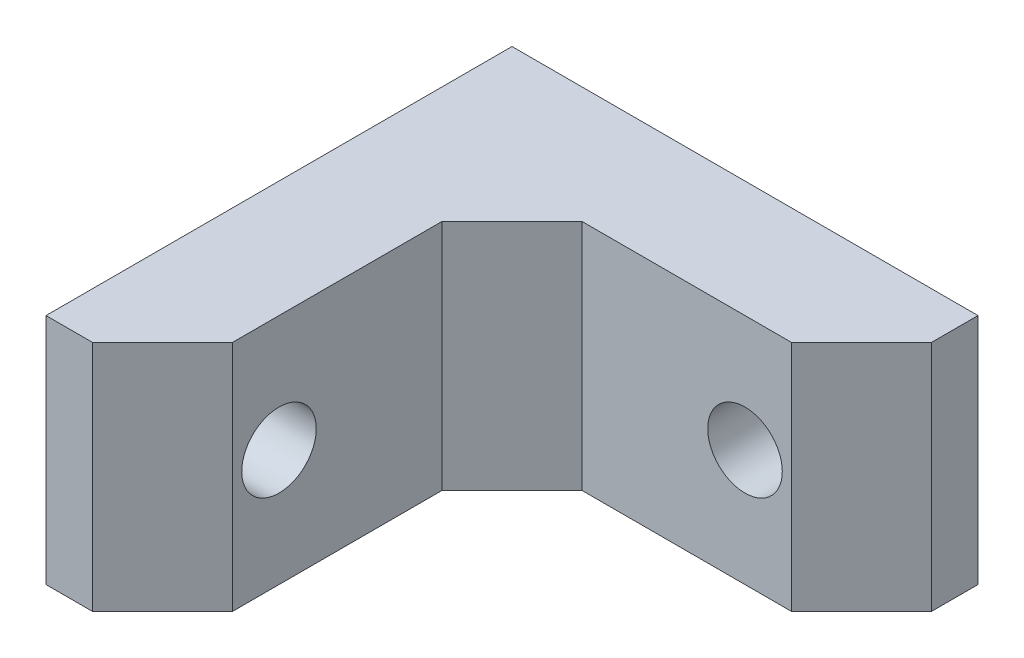
ISO-10303-21;
HEADER;
FILE_DESCRIPTION(('STEP AP214'),'2;1');
FILE_NAME('part.step','',(''),(''),'','','');
FILE_SCHEMA(('AUTOMOTIVE_DESIGN { 1 0 10303 214 1 1 1 1 }'));
ENDSEC;
DATA;
#1=APPLICATION_CONTEXT('core data for automotive mechanical design processes');
#2=APPLICATION_PROTOCOL_DEFINITION('international standard','automotive_design',2000,#1);
#3=PRODUCT_CONTEXT('',#1,'mechanical');
#4=PRODUCT('Part','Part','',(#3));
#5=PRODUCT_RELATED_PRODUCT_CATEGORY('part','',(#4));
#6=PRODUCT_DEFINITION_FORMATION('','',#4);
#7=PRODUCT_DEFINITION_CONTEXT('part definition',#1,'design');
#8=PRODUCT_DEFINITION('design','',#6,#7);
#9=PRODUCT_DEFINITION_SHAPE('','',#8);
#10=(LENGTH_UNIT() NAMED_UNIT(*) SI_UNIT(.MILLI.,.METRE.));
#11=(NAMED_UNIT(*) PLANE_ANGLE_UNIT() SI_UNIT($,.RADIAN.));
#12=(NAMED_UNIT(*) SI_UNIT($,.STERADIAN.) SOLID_ANGLE_UNIT());
#13=UNCERTAINTY_MEASURE_WITH_UNIT(LENGTH_MEASURE(1.E-05),#10,'distance_accuracy_value','');
#14=(GEOMETRIC_REPRESENTATION_CONTEXT(3) GLOBAL_UNCERTAINTY_ASSIGNED_CONTEXT((#13)) GLOBAL_UNIT_ASSIGNED_CONTEXT((#10,
#11,#12)) REPRESENTATION_CONTEXT('',''));
#15=CARTESIAN_POINT('',(0.,0.,0.));
#16=DIRECTION('',(0.,0.,1.));
#17=DIRECTION('',(1.,0.,0.));
#18=AXIS2_PLACEMENT_3D('',#15,#16,#17);
#19=CARTESIAN_POINT('',(0.,0.,5.));
#20=DIRECTION('',(0.,1.,0.));
#21=DIRECTION('',(0.,0.,1.));
#22=AXIS2_PLACEMENT_3D('',#19,#20,#21);
#23=PLANE('',#22);
#24=DIRECTION('',(0.,0.,-1.));
#25=VECTOR('',#24,1.);
#26=CARTESIAN_POINT('',(5.,0.,20.));
#27=LINE('',#26,#25);
#28=CARTESIAN_POINT('',(5.,0.,17.));
#29=VERTEX_POINT('',#28);
#30=CARTESIAN_POINT('',(5.,0.,7.99999999999998));
#31=VERTEX_POINT('',#30);
#32=EDGE_CURVE('E146',#29,#31,#27,.T.);
#33=ORIENTED_EDGE('',*,*,#32,.F.);
#34=DIRECTION('',(0.707106781186549,0.,-0.707106781186546));
#35=VECTOR('',#34,1.);
#36=CARTESIAN_POINT('',(5.,0.,17.));
#37=LINE('',#36,#35);
#38=CARTESIAN_POINT('',(1.99999999999999,0.,20.));
#39=VERTEX_POINT('',#38);
#40=EDGE_CURVE('E198',#29,#39,#37,.F.);
#41=ORIENTED_EDGE('',*,*,#40,.T.);
#42=DIRECTION('',(1.,0.,0.));
#43=VECTOR('',#42,1.);
#44=CARTESIAN_POINT('',(0.,0.,20.));
#45=LINE('',#44,#43);
#46=CARTESIAN_POINT('',(0.,0.,20.));
#47=VERTEX_POINT('',#46);
#48=EDGE_CURVE('E130',#47,#39,#45,.T.);
#49=ORIENTED_EDGE('',*,*,#48,.F.);
#50=DIRECTION('',(0.,0.,-1.));
#51=VECTOR('',#50,1.);
#52=CARTESIAN_POINT('',(0.,0.,20.));
#53=LINE('',#52,#51);
#54=CARTESIAN_POINT('',(0.,0.,0.));
#55=VERTEX_POINT('',#54);
#56=EDGE_CURVE('E116',#47,#55,#53,.T.);
#57=ORIENTED_EDGE('',*,*,#56,.T.);
#58=DIRECTION('',(1.,0.,0.));
#59=VECTOR('',#58,1.);
#60=CARTESIAN_POINT('',(0.,0.,0.));
#61=LINE('',#60,#59);
#62=CARTESIAN_POINT('',(20.,0.,0.));
#63=VERTEX_POINT('',#62);
#64=EDGE_CURVE('E236',#55,#63,#61,.T.);
#65=ORIENTED_EDGE('',*,*,#64,.T.);
#66=DIRECTION('',(0.,0.,-1.));
#67=VECTOR('',#66,1.);
#68=CARTESIAN_POINT('',(20.,0.,5.));
#69=LINE('',#68,#67);
#70=CARTESIAN_POINT('',(20.,0.,1.99999999999999));
#71=VERTEX_POINT('',#70);
#72=EDGE_CURVE('E153',#71,#63,#69,.T.);
#73=ORIENTED_EDGE('',*,*,#72,.F.);
#74=DIRECTION('',(-0.707106781186546,0.,0.707106781186549));
#75=VECTOR('',#74,1.);
#76=CARTESIAN_POINT('',(17.,0.,5.));
#77=LINE('',#76,#75);
#78=CARTESIAN_POINT('',(17.,0.,5.));
#79=VERTEX_POINT('',#78);
#80=EDGE_CURVE('E156',#71,#79,#77,.T.);
#81=ORIENTED_EDGE('',*,*,#80,.T.);
#82=DIRECTION('',(1.,0.,0.));
#83=VECTOR('',#82,1.);
#84=CARTESIAN_POINT('',(0.,0.,5.));
#85=LINE('',#84,#83);
#86=CARTESIAN_POINT('',(8.00000000000002,0.,5.));
#87=VERTEX_POINT('',#86);
#88=EDGE_CURVE('E157',#87,#79,#85,.T.);
#89=ORIENTED_EDGE('',*,*,#88,.F.);
#90=DIRECTION('',(0.707106781186552,0.,-0.707106781186543));
#91=VECTOR('',#90,1.);
#92=CARTESIAN_POINT('',(3.99999999999996,0.,9.00000000000001));
#93=LINE('',#92,#91);
#94=EDGE_CURVE('E43',#87,#31,#93,.F.);
#95=ORIENTED_EDGE('',*,*,#94,.T.);
#96=EDGE_LOOP('',(#33,#41,#49,#57,#65,#73,#81,#89,#95));
#97=FACE_BOUND('',#96,.T.);
#98=ADVANCED_FACE('F35',(#97),#23,.F.);
#99=CARTESIAN_POINT('',(20.,0.,5.));
#100=DIRECTION('',(-1.,0.,0.));
#101=DIRECTION('',(0.,0.,1.));
#102=AXIS2_PLACEMENT_3D('',#99,#100,#101);
#103=PLANE('',#102);
#104=DIRECTION('',(0.,0.,-1.));
#105=VECTOR('',#104,1.);
#106=CARTESIAN_POINT('',(20.,10.,5.));
#107=LINE('',#106,#105);
#108=CARTESIAN_POINT('',(20.,10.,1.99999999999999));
#109=VERTEX_POINT('',#108);
#110=CARTESIAN_POINT('',(20.,10.,0.));
#111=VERTEX_POINT('',#110);
#112=EDGE_CURVE('E171',#109,#111,#107,.T.);
#113=ORIENTED_EDGE('',*,*,#112,.F.);
#114=DIRECTION('',(0.,-1.,0.));
#115=VECTOR('',#114,1.);
#116=CARTESIAN_POINT('',(20.,0.,1.99999999999999));
#117=LINE('',#116,#115);
#118=EDGE_CURVE('E180',#109,#71,#117,.T.);
#119=ORIENTED_EDGE('',*,*,#118,.T.);
#120=ORIENTED_EDGE('',*,*,#72,.T.);
#121=DIRECTION('',(0.,1.,0.));
#122=VECTOR('',#121,1.);
#123=CARTESIAN_POINT('',(20.,0.,0.));
#124=LINE('',#123,#122);
#125=EDGE_CURVE('E239',#63,#111,#124,.T.);
#126=ORIENTED_EDGE('',*,*,#125,.T.);
#127=EDGE_LOOP('',(#113,#119,#120,#126));
#128=FACE_BOUND('',#127,.T.);
#129=ADVANCED_FACE('F212',(#128),#103,.F.);
#130=CARTESIAN_POINT('',(0.,10.,5.));
#131=DIRECTION('',(0.,1.,0.));
#132=DIRECTION('',(0.,0.,1.));
#133=AXIS2_PLACEMENT_3D('',#130,#131,#132);
#134=PLANE('',#133);
#135=DIRECTION('',(1.,0.,0.));
#136=VECTOR('',#135,1.);
#137=CARTESIAN_POINT('',(0.,10.,20.));
#138=LINE('',#137,#136);
#139=CARTESIAN_POINT('',(0.,10.,20.));
#140=VERTEX_POINT('',#139);
#141=CARTESIAN_POINT('',(1.99999999999999,10.,20.));
#142=VERTEX_POINT('',#141);
#143=EDGE_CURVE('E107',#140,#142,#138,.T.);
#144=ORIENTED_EDGE('',*,*,#143,.T.);
#145=DIRECTION('',(-0.707106781186549,0.,0.707106781186546));
#146=VECTOR('',#145,1.);
#147=CARTESIAN_POINT('',(8.49999999999999,10.,13.5));
#148=LINE('',#147,#146);
#149=CARTESIAN_POINT('',(5.,10.,17.));
#150=VERTEX_POINT('',#149);
#151=EDGE_CURVE('E173',#142,#150,#148,.F.);
#152=ORIENTED_EDGE('',*,*,#151,.T.);
#153=DIRECTION('',(0.,0.,-1.));
#154=VECTOR('',#153,1.);
#155=CARTESIAN_POINT('',(5.,10.,20.));
#156=LINE('',#155,#154);
#157=CARTESIAN_POINT('',(5.,10.,7.99999999999998));
#158=VERTEX_POINT('',#157);
#159=EDGE_CURVE('E132',#150,#158,#156,.T.);
#160=ORIENTED_EDGE('',*,*,#159,.T.);
#161=DIRECTION('',(-0.707106781186552,0.,0.707106781186543));
#162=VECTOR('',#161,1.);
#163=CARTESIAN_POINT('',(8.00000000000002,10.,5.));
#164=LINE('',#163,#162);
#165=CARTESIAN_POINT('',(8.00000000000002,10.,5.));
#166=VERTEX_POINT('',#165);
#167=EDGE_CURVE('E11',#158,#166,#164,.F.);
#168=ORIENTED_EDGE('',*,*,#167,.T.);
#169=DIRECTION('',(1.,0.,0.));
#170=VECTOR('',#169,1.);
#171=CARTESIAN_POINT('',(0.,10.,5.));
#172=LINE('',#171,#170);
#173=CARTESIAN_POINT('',(17.,10.,5.));
#174=VERTEX_POINT('',#173);
#175=EDGE_CURVE('E161',#166,#174,#172,.T.);
#176=ORIENTED_EDGE('',*,*,#175,.T.);
#177=DIRECTION('',(0.707106781186546,0.,-0.707106781186549));
#178=VECTOR('',#177,1.);
#179=CARTESIAN_POINT('',(8.50000000000003,10.,13.5));
#180=LINE('',#179,#178);
#181=EDGE_CURVE('E50',#174,#109,#180,.T.);
#182=ORIENTED_EDGE('',*,*,#181,.T.);
#183=ORIENTED_EDGE('',*,*,#112,.T.);
#184=DIRECTION('',(1.,0.,0.));
#185=VECTOR('',#184,1.);
#186=CARTESIAN_POINT('',(0.,10.,0.));
#187=LINE('',#186,#185);
#188=CARTESIAN_POINT('',(0.,10.,0.));
#189=VERTEX_POINT('',#188);
#190=EDGE_CURVE('E110',#189,#111,#187,.T.);
#191=ORIENTED_EDGE('',*,*,#190,.F.);
#192=DIRECTION('',(0.,0.,-1.));
#193=VECTOR('',#192,1.);
#194=CARTESIAN_POINT('',(0.,10.,20.));
#195=LINE('',#194,#193);
#196=EDGE_CURVE('E104',#140,#189,#195,.T.);
#197=ORIENTED_EDGE('',*,*,#196,.F.);
#198=EDGE_LOOP('',(#144,#152,#160,#168,#176,#182,#183,#191,#197));
#199=FACE_BOUND('',#198,.T.);
#200=ADVANCED_FACE('F106',(#199),#134,.T.);
#201=CARTESIAN_POINT('',(15.,5.,5.));
#202=DIRECTION('',(0.,0.,-1.));
#203=DIRECTION('',(-1.,0.,0.));
#204=AXIS2_PLACEMENT_3D('',#201,#202,#203);
#205=CYLINDRICAL_SURFACE('',#204,1.6);
#206=CARTESIAN_POINT('',(15.,5.,5.));
#207=DIRECTION('',(0.,0.,1.));
#208=DIRECTION('',(1.,0.,0.));
#209=AXIS2_PLACEMENT_3D('',#206,#207,#208);
#210=CIRCLE('',#209,1.6);
#211=CARTESIAN_POINT('',(16.6,5.,5.));
#212=VERTEX_POINT('',#211);
#213=EDGE_CURVE('E162',#212,#212,#210,.T.);
#214=ORIENTED_EDGE('',*,*,#213,.T.);
#215=EDGE_LOOP('',(#214));
#216=FACE_BOUND('',#215,.T.);
#217=CARTESIAN_POINT('',(15.,5.,0.));
#218=DIRECTION('',(0.,0.,1.));
#219=DIRECTION('',(1.,0.,0.));
#220=AXIS2_PLACEMENT_3D('',#217,#218,#219);
#221=CIRCLE('',#220,1.6);
#222=CARTESIAN_POINT('',(16.6,5.,0.));
#223=VERTEX_POINT('',#222);
#224=EDGE_CURVE('E115',#223,#223,#221,.T.);
#225=ORIENTED_EDGE('',*,*,#224,.F.);
#226=EDGE_LOOP('',(#225));
#227=FACE_BOUND('',#226,.T.);
#228=ADVANCED_FACE('F220',(#216,#227),#205,.F.);
#229=CARTESIAN_POINT('',(0.,0.,5.));
#230=DIRECTION('',(0.,0.,1.));
#231=DIRECTION('',(1.,0.,0.));
#232=AXIS2_PLACEMENT_3D('',#229,#230,#231);
#233=PLANE('',#232);
#234=ORIENTED_EDGE('',*,*,#213,.F.);
#235=EDGE_LOOP('',(#234));
#236=FACE_BOUND('',#235,.T.);
#237=ORIENTED_EDGE('',*,*,#88,.T.);
#238=DIRECTION('',(0.,1.,0.));
#239=VECTOR('',#238,1.);
#240=CARTESIAN_POINT('',(17.,10.,5.));
#241=LINE('',#240,#239);
#242=EDGE_CURVE('E178',#79,#174,#241,.T.);
#243=ORIENTED_EDGE('',*,*,#242,.T.);
#244=ORIENTED_EDGE('',*,*,#175,.F.);
#245=DIRECTION('',(0.,-1.,0.));
#246=VECTOR('',#245,1.);
#247=CARTESIAN_POINT('',(8.00000000000002,0.,5.));
#248=LINE('',#247,#246);
#249=EDGE_CURVE('E175',#166,#87,#248,.T.);
#250=ORIENTED_EDGE('',*,*,#249,.T.);
#251=EDGE_LOOP('',(#237,#243,#244,#250));
#252=FACE_BOUND('',#251,.T.);
#253=ADVANCED_FACE('F194',(#236,#252),#233,.T.);
#254=CARTESIAN_POINT('',(0.,0.,0.));
#255=DIRECTION('',(0.,0.,1.));
#256=DIRECTION('',(1.,0.,0.));
#257=AXIS2_PLACEMENT_3D('',#254,#255,#256);
#258=PLANE('',#257);
#259=ORIENTED_EDGE('',*,*,#224,.T.);
#260=EDGE_LOOP('',(#259));
#261=FACE_BOUND('',#260,.T.);
#262=ORIENTED_EDGE('',*,*,#64,.F.);
#263=DIRECTION('',(0.,1.,0.));
#264=VECTOR('',#263,1.);
#265=CARTESIAN_POINT('',(0.,0.,0.));
#266=LINE('',#265,#264);
#267=EDGE_CURVE('E125',#55,#189,#266,.T.);
#268=ORIENTED_EDGE('',*,*,#267,.T.);
#269=ORIENTED_EDGE('',*,*,#190,.T.);
#270=ORIENTED_EDGE('',*,*,#125,.F.);
#271=EDGE_LOOP('',(#262,#268,#269,#270));
#272=FACE_BOUND('',#271,.T.);
#273=ADVANCED_FACE('F227',(#261,#272),#258,.F.);
#274=CARTESIAN_POINT('',(5.,0.,20.));
#275=DIRECTION('',(1.,0.,0.));
#276=DIRECTION('',(0.,1.,0.));
#277=AXIS2_PLACEMENT_3D('',#274,#275,#276);
#278=PLANE('',#277);
#279=CARTESIAN_POINT('',(5.,5.,15.));
#280=DIRECTION('',(1.,0.,0.));
#281=DIRECTION('',(0.,1.,0.));
#282=AXIS2_PLACEMENT_3D('',#279,#280,#281);
#283=CIRCLE('',#282,1.6);
#284=CARTESIAN_POINT('',(5.,6.6,15.));
#285=VERTEX_POINT('',#284);
#286=EDGE_CURVE('E341',#285,#285,#283,.T.);
#287=ORIENTED_EDGE('',*,*,#286,.F.);
#288=EDGE_LOOP('',(#287));
#289=FACE_BOUND('',#288,.T.);
#290=ORIENTED_EDGE('',*,*,#159,.F.);
#291=DIRECTION('',(0.,-1.,0.));
#292=VECTOR('',#291,1.);
#293=CARTESIAN_POINT('',(5.,0.,17.));
#294=LINE('',#293,#292);
#295=EDGE_CURVE('E152',#150,#29,#294,.T.);
#296=ORIENTED_EDGE('',*,*,#295,.T.);
#297=ORIENTED_EDGE('',*,*,#32,.T.);
#298=DIRECTION('',(0.,1.,0.));
#299=VECTOR('',#298,1.);
#300=CARTESIAN_POINT('',(5.,10.,7.99999999999998));
#301=LINE('',#300,#299);
#302=EDGE_CURVE('E150',#31,#158,#301,.T.);
#303=ORIENTED_EDGE('',*,*,#302,.T.);
#304=EDGE_LOOP('',(#290,#296,#297,#303));
#305=FACE_BOUND('',#304,.T.);
#306=ADVANCED_FACE('F189',(#289,#305),#278,.T.);
#307=CARTESIAN_POINT('',(0.,0.,20.));
#308=DIRECTION('',(-1.,0.,0.));
#309=DIRECTION('',(0.,0.,1.));
#310=AXIS2_PLACEMENT_3D('',#307,#308,#309);
#311=PLANE('',#310);
#312=CARTESIAN_POINT('',(0.,5.,15.));
#313=DIRECTION('',(-1.,0.,0.));
#314=DIRECTION('',(0.,0.,1.));
#315=AXIS2_PLACEMENT_3D('',#312,#313,#314);
#316=CIRCLE('',#315,1.6);
#317=CARTESIAN_POINT('',(0.,5.,16.6));
#318=VERTEX_POINT('',#317);
#319=EDGE_CURVE('E137',#318,#318,#316,.T.);
#320=ORIENTED_EDGE('',*,*,#319,.F.);
#321=EDGE_LOOP('',(#320));
#322=FACE_BOUND('',#321,.T.);
#323=ORIENTED_EDGE('',*,*,#267,.F.);
#324=ORIENTED_EDGE('',*,*,#56,.F.);
#325=DIRECTION('',(0.,1.,0.));
#326=VECTOR('',#325,1.);
#327=CARTESIAN_POINT('',(0.,0.,20.));
#328=LINE('',#327,#326);
#329=EDGE_CURVE('E122',#47,#140,#328,.T.);
#330=ORIENTED_EDGE('',*,*,#329,.T.);
#331=ORIENTED_EDGE('',*,*,#196,.T.);
#332=EDGE_LOOP('',(#323,#324,#330,#331));
#333=FACE_BOUND('',#332,.T.);
#334=ADVANCED_FACE('F127',(#322,#333),#311,.T.);
#335=CARTESIAN_POINT('',(0.,0.,20.));
#336=DIRECTION('',(0.,0.,1.));
#337=DIRECTION('',(1.,0.,0.));
#338=AXIS2_PLACEMENT_3D('',#335,#336,#337);
#339=PLANE('',#338);
#340=ORIENTED_EDGE('',*,*,#48,.T.);
#341=DIRECTION('',(0.,1.,0.));
#342=VECTOR('',#341,1.);
#343=CARTESIAN_POINT('',(1.99999999999999,0.,20.));
#344=LINE('',#343,#342);
#345=EDGE_CURVE('E124',#39,#142,#344,.T.);
#346=ORIENTED_EDGE('',*,*,#345,.T.);
#347=ORIENTED_EDGE('',*,*,#143,.F.);
#348=ORIENTED_EDGE('',*,*,#329,.F.);
#349=EDGE_LOOP('',(#340,#346,#347,#348));
#350=FACE_BOUND('',#349,.T.);
#351=ADVANCED_FACE('F121',(#350),#339,.T.);
#352=CARTESIAN_POINT('',(-15.,5.,15.));
#353=DIRECTION('',(1.,0.,0.));
#354=DIRECTION('',(0.,1.,0.));
#355=AXIS2_PLACEMENT_3D('',#352,#353,#354);
#356=CYLINDRICAL_SURFACE('',#355,1.6);
#357=ORIENTED_EDGE('',*,*,#319,.T.);
#358=EDGE_LOOP('',(#357));
#359=FACE_BOUND('',#358,.T.);
#360=ORIENTED_EDGE('',*,*,#286,.T.);
#361=EDGE_LOOP('',(#360));
#362=FACE_BOUND('',#361,.T.);
#363=ADVANCED_FACE('F202',(#359,#362),#356,.F.);
#364=CARTESIAN_POINT('',(5.,0.,17.));
#365=DIRECTION('',(-0.707106781186546,0.,-0.707106781186549));
#366=DIRECTION('',(0.,-1.,0.));
#367=AXIS2_PLACEMENT_3D('',#364,#365,#366);
#368=PLANE('',#367);
#369=ORIENTED_EDGE('',*,*,#151,.F.);
#370=ORIENTED_EDGE('',*,*,#345,.F.);
#371=ORIENTED_EDGE('',*,*,#40,.F.);
#372=ORIENTED_EDGE('',*,*,#295,.F.);
#373=EDGE_LOOP('',(#369,#370,#371,#372));
#374=FACE_BOUND('',#373,.T.);
#375=ADVANCED_FACE('F200',(#374),#368,.F.);
#376=CARTESIAN_POINT('',(17.,0.,5.));
#377=DIRECTION('',(0.707106781186549,0.,0.707106781186546));
#378=DIRECTION('',(0.,-1.,0.));
#379=AXIS2_PLACEMENT_3D('',#376,#377,#378);
#380=PLANE('',#379);
#381=ORIENTED_EDGE('',*,*,#80,.F.);
#382=ORIENTED_EDGE('',*,*,#118,.F.);
#383=ORIENTED_EDGE('',*,*,#181,.F.);
#384=ORIENTED_EDGE('',*,*,#242,.F.);
#385=EDGE_LOOP('',(#381,#382,#383,#384));
#386=FACE_BOUND('',#385,.T.);
#387=ADVANCED_FACE('F196',(#386),#380,.T.);
#388=CARTESIAN_POINT('',(8.00000000000002,0.,5.));
#389=DIRECTION('',(0.707106781186543,0.,0.707106781186552));
#390=DIRECTION('',(0.,1.,0.));
#391=AXIS2_PLACEMENT_3D('',#388,#389,#390);
#392=PLANE('',#391);
#393=ORIENTED_EDGE('',*,*,#167,.F.);
#394=ORIENTED_EDGE('',*,*,#302,.F.);
#395=ORIENTED_EDGE('',*,*,#94,.F.);
#396=ORIENTED_EDGE('',*,*,#249,.F.);
#397=EDGE_LOOP('',(#393,#394,#395,#396));
#398=FACE_BOUND('',#397,.T.);
#399=ADVANCED_FACE('F37',(#398),#392,.T.);
#400=CLOSED_SHELL('',(#98,#129,#200,#228,#253,#273,#306,#334,#351,#363,#375,#387,#399));
#401=MANIFOLD_SOLID_BREP('B2',#400);
#402=ADVANCED_BREP_SHAPE_REPRESENTATION('',(#18,#401),#14);
#403=SHAPE_DEFINITION_REPRESENTATION(#9,#402);
ENDSEC;
END-ISO-10303-21;
